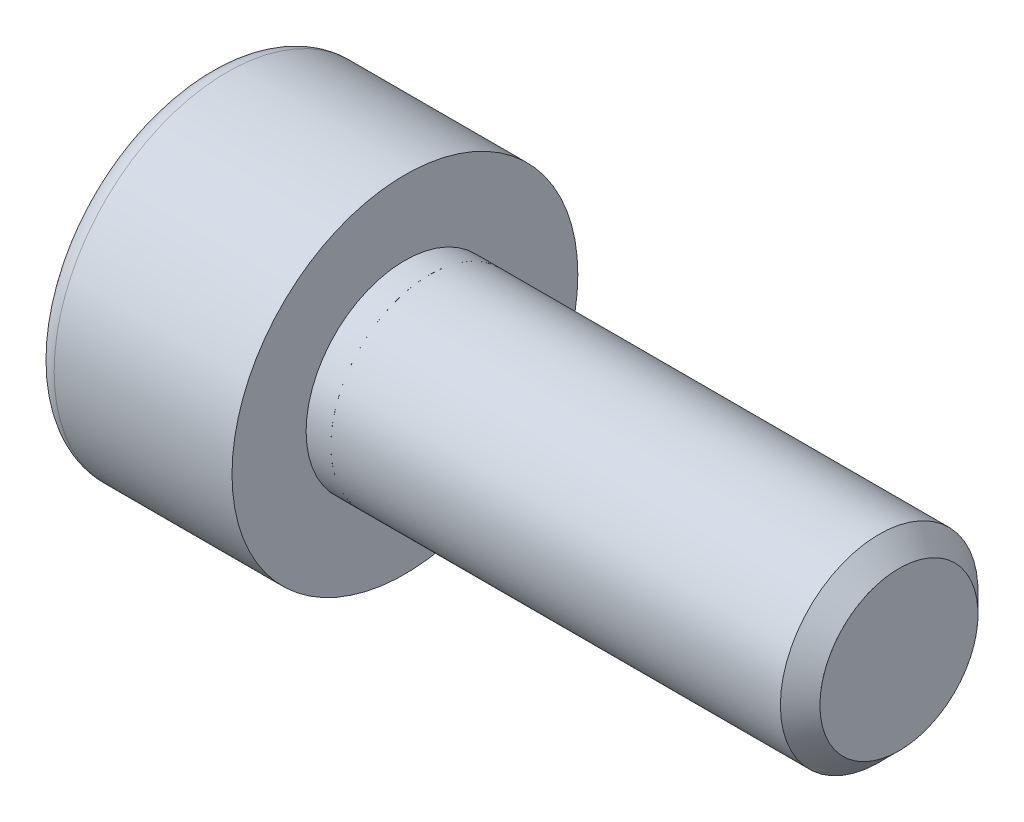
ISO-10303-21;
HEADER;
FILE_DESCRIPTION(('STEP AP214'),'2;1');
FILE_NAME('part.step','',(''),(''),'','','');
FILE_SCHEMA(('AUTOMOTIVE_DESIGN { 1 0 10303 214 1 1 1 1 }'));
ENDSEC;
DATA;
#1=APPLICATION_CONTEXT('core data for automotive mechanical design processes');
#2=APPLICATION_PROTOCOL_DEFINITION('international standard','automotive_design',2000,#1);
#3=PRODUCT_CONTEXT('',#1,'mechanical');
#4=PRODUCT('Part','Part','',(#3));
#5=PRODUCT_RELATED_PRODUCT_CATEGORY('part','',(#4));
#6=PRODUCT_DEFINITION_FORMATION('','',#4);
#7=PRODUCT_DEFINITION_CONTEXT('part definition',#1,'design');
#8=PRODUCT_DEFINITION('design','',#6,#7);
#9=PRODUCT_DEFINITION_SHAPE('','',#8);
#10=(LENGTH_UNIT() NAMED_UNIT(*) SI_UNIT(.MILLI.,.METRE.));
#11=(NAMED_UNIT(*) PLANE_ANGLE_UNIT() SI_UNIT($,.RADIAN.));
#12=(NAMED_UNIT(*) SI_UNIT($,.STERADIAN.) SOLID_ANGLE_UNIT());
#13=UNCERTAINTY_MEASURE_WITH_UNIT(LENGTH_MEASURE(1.E-05),#10,'distance_accuracy_value','');
#14=(GEOMETRIC_REPRESENTATION_CONTEXT(3) GLOBAL_UNCERTAINTY_ASSIGNED_CONTEXT((#13)) GLOBAL_UNIT_ASSIGNED_CONTEXT((#10,
#11,#12)) REPRESENTATION_CONTEXT('',''));
#15=CARTESIAN_POINT('',(0.,0.,0.));
#16=DIRECTION('',(0.,0.,1.));
#17=DIRECTION('',(1.,0.,0.));
#18=AXIS2_PLACEMENT_3D('',#15,#16,#17);
#19=CARTESIAN_POINT('',(2.,-1.5,-0.8660254037844));
#20=DIRECTION('',(0.,-1.,0.));
#21=DIRECTION('',(0.,0.,-1.));
#22=AXIS2_PLACEMENT_3D('',#19,#20,#21);
#23=PLANE('',#22);
#24=DIRECTION('',(1.,0.,0.));
#25=VECTOR('',#24,1.);
#26=CARTESIAN_POINT('',(2.,-1.50000000000005,-0.866025403784492));
#27=LINE('',#26,#25);
#28=CARTESIAN_POINT('',(2.,-1.50000000000002,-0.866025403784446));
#29=VERTEX_POINT('',#28);
#30=CARTESIAN_POINT('',(0.,-1.50000000000001,-0.866025403784442));
#31=VERTEX_POINT('',#30);
#32=EDGE_CURVE('P0_E82',#29,#31,#27,.F.);
#33=ORIENTED_EDGE('',*,*,#32,.T.);
#34=DIRECTION('',(0.,0.,-1.));
#35=VECTOR('',#34,1.);
#36=CARTESIAN_POINT('',(0.,-1.5,-0.8660254037844));
#37=LINE('',#36,#35);
#38=CARTESIAN_POINT('',(0.,-1.5,0.8660254037844));
#39=VERTEX_POINT('',#38);
#40=EDGE_CURVE('P0_E72',#39,#31,#37,.T.);
#41=ORIENTED_EDGE('',*,*,#40,.F.);
#42=DIRECTION('',(1.,0.,0.));
#43=VECTOR('',#42,1.);
#44=CARTESIAN_POINT('',(2.,-1.5,0.8660254037844));
#45=LINE('',#44,#43);
#46=CARTESIAN_POINT('',(2.,-1.50000000000001,0.866025403784396));
#47=VERTEX_POINT('',#46);
#48=EDGE_CURVE('P0_E132',#39,#47,#45,.T.);
#49=ORIENTED_EDGE('',*,*,#48,.T.);
#50=DIRECTION('',(0.,0.,-1.));
#51=VECTOR('',#50,1.);
#52=CARTESIAN_POINT('',(2.,-1.5,-0.8660254037844));
#53=LINE('',#52,#51);
#54=EDGE_CURVE('P0_E68',#29,#47,#53,.F.);
#55=ORIENTED_EDGE('',*,*,#54,.F.);
#56=EDGE_LOOP('',(#33,#41,#49,#55));
#57=FACE_BOUND('',#56,.T.);
#58=ADVANCED_FACE('P0_F17',(#57),#23,.F.);
#59=CARTESIAN_POINT('',(2.,0.,-1.732050807569));
#60=DIRECTION('',(0.,-0.500000000000017,-0.866025403784429));
#61=DIRECTION('',(0.,0.866025403784429,-0.500000000000017));
#62=AXIS2_PLACEMENT_3D('',#59,#60,#61);
#63=PLANE('',#62);
#64=DIRECTION('',(1.,0.,0.));
#65=VECTOR('',#64,1.);
#66=CARTESIAN_POINT('',(2.,0.,-1.73205080756891));
#67=LINE('',#66,#65);
#68=CARTESIAN_POINT('',(2.,0.,-1.73205080756896));
#69=VERTEX_POINT('',#68);
#70=CARTESIAN_POINT('',(0.,0.,-1.73205080756897));
#71=VERTEX_POINT('',#70);
#72=EDGE_CURVE('P0_E87',#69,#71,#67,.F.);
#73=ORIENTED_EDGE('',*,*,#72,.T.);
#74=DIRECTION('',(0.,0.866025403784429,-0.500000000000017));
#75=VECTOR('',#74,1.);
#76=CARTESIAN_POINT('',(0.,0.,-1.732050807569));
#77=LINE('',#76,#75);
#78=EDGE_CURVE('P0_E75',#31,#71,#77,.T.);
#79=ORIENTED_EDGE('',*,*,#78,.F.);
#80=ORIENTED_EDGE('',*,*,#32,.F.);
#81=DIRECTION('',(0.,0.866025403784429,-0.500000000000017));
#82=VECTOR('',#81,1.);
#83=CARTESIAN_POINT('',(2.,0.,-1.732050807569));
#84=LINE('',#83,#82);
#85=EDGE_CURVE('P0_E88',#69,#29,#84,.F.);
#86=ORIENTED_EDGE('',*,*,#85,.F.);
#87=EDGE_LOOP('',(#73,#79,#80,#86));
#88=FACE_BOUND('',#87,.T.);
#89=ADVANCED_FACE('P0_F85',(#88),#63,.F.);
#90=CARTESIAN_POINT('',(2.,-1.5,0.8660254037844));
#91=DIRECTION('',(0.,-0.500000000000017,0.866025403784429));
#92=DIRECTION('',(0.,-0.866025403784429,-0.500000000000017));
#93=AXIS2_PLACEMENT_3D('',#90,#91,#92);
#94=PLANE('',#93);
#95=ORIENTED_EDGE('',*,*,#48,.F.);
#96=DIRECTION('',(0.,-0.866025403784429,-0.500000000000017));
#97=VECTOR('',#96,1.);
#98=CARTESIAN_POINT('',(0.,-1.5,0.8660254037844));
#99=LINE('',#98,#97);
#100=CARTESIAN_POINT('',(0.,0.,1.73205080756896));
#101=VERTEX_POINT('',#100);
#102=EDGE_CURVE('P0_E78',#101,#39,#99,.T.);
#103=ORIENTED_EDGE('',*,*,#102,.F.);
#104=DIRECTION('',(1.,0.,0.));
#105=VECTOR('',#104,1.);
#106=CARTESIAN_POINT('',(2.,0.,1.73205080756899));
#107=LINE('',#106,#105);
#108=CARTESIAN_POINT('',(2.,0.,1.73205080756895));
#109=VERTEX_POINT('',#108);
#110=EDGE_CURVE('P0_E123',#101,#109,#107,.T.);
#111=ORIENTED_EDGE('',*,*,#110,.T.);
#112=DIRECTION('',(0.,-0.866025403784429,-0.500000000000017));
#113=VECTOR('',#112,1.);
#114=CARTESIAN_POINT('',(2.,-1.5,0.8660254037844));
#115=LINE('',#114,#113);
#116=EDGE_CURVE('P0_E130',#47,#109,#115,.F.);
#117=ORIENTED_EDGE('',*,*,#116,.F.);
#118=EDGE_LOOP('',(#95,#103,#111,#117));
#119=FACE_BOUND('',#118,.T.);
#120=ADVANCED_FACE('P0_F135',(#119),#94,.F.);
#121=CARTESIAN_POINT('',(2.,1.5,-0.8660254037844));
#122=DIRECTION('',(0.,0.500000000000017,-0.866025403784429));
#123=DIRECTION('',(0.,0.866025403784429,0.500000000000017));
#124=AXIS2_PLACEMENT_3D('',#121,#122,#123);
#125=PLANE('',#124);
#126=DIRECTION('',(1.,0.,0.));
#127=VECTOR('',#126,1.);
#128=CARTESIAN_POINT('',(2.,1.5,-0.8660254037844));
#129=LINE('',#128,#127);
#130=CARTESIAN_POINT('',(2.,1.5,-0.866025403784398));
#131=VERTEX_POINT('',#130);
#132=CARTESIAN_POINT('',(0.,1.5,-0.8660254037844));
#133=VERTEX_POINT('',#132);
#134=EDGE_CURVE('P0_E115',#131,#133,#129,.F.);
#135=ORIENTED_EDGE('',*,*,#134,.T.);
#136=DIRECTION('',(0.,0.866025403784429,0.500000000000017));
#137=VECTOR('',#136,1.);
#138=CARTESIAN_POINT('',(0.,1.5,-0.8660254037844));
#139=LINE('',#138,#137);
#140=EDGE_CURVE('P0_E36',#71,#133,#139,.T.);
#141=ORIENTED_EDGE('',*,*,#140,.F.);
#142=ORIENTED_EDGE('',*,*,#72,.F.);
#143=DIRECTION('',(0.,-0.866025403784414,-0.500000000000043));
#144=VECTOR('',#143,1.);
#145=CARTESIAN_POINT('',(2.,1.5,-0.8660254037844));
#146=LINE('',#145,#144);
#147=EDGE_CURVE('P0_E117',#131,#69,#146,.T.);
#148=ORIENTED_EDGE('',*,*,#147,.F.);
#149=EDGE_LOOP('',(#135,#141,#142,#148));
#150=FACE_BOUND('',#149,.T.);
#151=ADVANCED_FACE('P0_F142',(#150),#125,.F.);
#152=CARTESIAN_POINT('',(2.,0.,1.732050807569));
#153=DIRECTION('',(0.,0.500000000000017,0.866025403784429));
#154=DIRECTION('',(0.,-0.866025403784429,0.500000000000017));
#155=AXIS2_PLACEMENT_3D('',#152,#153,#154);
#156=PLANE('',#155);
#157=ORIENTED_EDGE('',*,*,#110,.F.);
#158=DIRECTION('',(0.,-0.866025403784429,0.500000000000017));
#159=VECTOR('',#158,1.);
#160=CARTESIAN_POINT('',(0.,0.,1.732050807569));
#161=LINE('',#160,#159);
#162=CARTESIAN_POINT('',(0.,1.50000000000003,0.866025403784459));
#163=VERTEX_POINT('',#162);
#164=EDGE_CURVE('P0_E126',#163,#101,#161,.T.);
#165=ORIENTED_EDGE('',*,*,#164,.F.);
#166=DIRECTION('',(1.,0.,0.));
#167=VECTOR('',#166,1.);
#168=CARTESIAN_POINT('',(2.,1.5,0.866025403784423));
#169=LINE('',#168,#167);
#170=CARTESIAN_POINT('',(2.,1.50000000000003,0.866025403784458));
#171=VERTEX_POINT('',#170);
#172=EDGE_CURVE('P0_E113',#163,#171,#169,.T.);
#173=ORIENTED_EDGE('',*,*,#172,.T.);
#174=DIRECTION('',(0.,0.86602540378441,-0.50000000000005));
#175=VECTOR('',#174,1.);
#176=CARTESIAN_POINT('',(2.,0.,1.73205080756898));
#177=LINE('',#176,#175);
#178=EDGE_CURVE('P0_E120',#109,#171,#177,.T.);
#179=ORIENTED_EDGE('',*,*,#178,.F.);
#180=EDGE_LOOP('',(#157,#165,#173,#179));
#181=FACE_BOUND('',#180,.T.);
#182=ADVANCED_FACE('P0_F149',(#181),#156,.F.);
#183=CARTESIAN_POINT('',(2.,0.,0.));
#184=DIRECTION('',(-1.,0.,0.));
#185=DIRECTION('',(0.,0.,1.));
#186=AXIS2_PLACEMENT_3D('',#183,#184,#185);
#187=PLANE('',#186);
#188=ORIENTED_EDGE('',*,*,#147,.T.);
#189=ORIENTED_EDGE('',*,*,#85,.T.);
#190=ORIENTED_EDGE('',*,*,#54,.T.);
#191=ORIENTED_EDGE('',*,*,#116,.T.);
#192=ORIENTED_EDGE('',*,*,#178,.T.);
#193=DIRECTION('',(0.,0.,1.));
#194=VECTOR('',#193,1.);
#195=CARTESIAN_POINT('',(2.,1.5,0.8660254037844));
#196=LINE('',#195,#194);
#197=EDGE_CURVE('P0_E110',#171,#131,#196,.F.);
#198=ORIENTED_EDGE('',*,*,#197,.T.);
#199=EDGE_LOOP('',(#188,#189,#190,#191,#192,#198));
#200=FACE_BOUND('',#199,.T.);
#201=ADVANCED_FACE('P0_F139',(#200),#187,.T.);
#202=CARTESIAN_POINT('',(2.,1.5,0.8660254037844));
#203=DIRECTION('',(0.,1.,0.));
#204=DIRECTION('',(0.,0.,1.));
#205=AXIS2_PLACEMENT_3D('',#202,#203,#204);
#206=PLANE('',#205);
#207=ORIENTED_EDGE('',*,*,#172,.F.);
#208=DIRECTION('',(0.,0.,1.));
#209=VECTOR('',#208,1.);
#210=CARTESIAN_POINT('',(0.,1.5,0.));
#211=LINE('',#210,#209);
#212=EDGE_CURVE('P0_E106',#133,#163,#211,.T.);
#213=ORIENTED_EDGE('',*,*,#212,.F.);
#214=ORIENTED_EDGE('',*,*,#134,.F.);
#215=ORIENTED_EDGE('',*,*,#197,.F.);
#216=EDGE_LOOP('',(#207,#213,#214,#215));
#217=FACE_BOUND('',#216,.T.);
#218=ADVANCED_FACE('P0_F147',(#217),#206,.F.);
#219=CARTESIAN_POINT('',(0.,0.,0.));
#220=DIRECTION('',(-1.,0.,0.));
#221=DIRECTION('',(0.,0.,1.));
#222=AXIS2_PLACEMENT_3D('',#219,#220,#221);
#223=PLANE('',#222);
#224=CARTESIAN_POINT('',(0.,0.,0.));
#225=DIRECTION('',(-1.,0.,0.));
#226=DIRECTION('',(0.,0.,1.));
#227=AXIS2_PLACEMENT_3D('',#224,#225,#226);
#228=CIRCLE('',#227,3.1);
#229=CARTESIAN_POINT('',(0.,0.,3.1));
#230=VERTEX_POINT('',#229);
#231=EDGE_CURVE('P0_E21',#230,#230,#228,.F.);
#232=ORIENTED_EDGE('',*,*,#231,.F.);
#233=EDGE_LOOP('',(#232));
#234=FACE_BOUND('',#233,.T.);
#235=ORIENTED_EDGE('',*,*,#140,.T.);
#236=ORIENTED_EDGE('',*,*,#212,.T.);
#237=ORIENTED_EDGE('',*,*,#164,.T.);
#238=ORIENTED_EDGE('',*,*,#102,.T.);
#239=ORIENTED_EDGE('',*,*,#40,.T.);
#240=ORIENTED_EDGE('',*,*,#78,.T.);
#241=EDGE_LOOP('',(#235,#236,#237,#238,#239,#240));
#242=FACE_BOUND('',#241,.T.);
#243=ADVANCED_FACE('P0_F73',(#234,#242),#223,.T.);
#244=CARTESIAN_POINT('',(0.4,0.,0.));
#245=DIRECTION('',(-1.,0.,0.));
#246=DIRECTION('',(0.,0.,1.));
#247=AXIS2_PLACEMENT_3D('',#244,#245,#246);
#248=TOROIDAL_SURFACE('',#247,3.1,0.4);
#249=CARTESIAN_POINT('',(0.399999999999999,0.,0.));
#250=DIRECTION('',(-1.,0.,0.));
#251=DIRECTION('',(0.,0.,1.));
#252=AXIS2_PLACEMENT_3D('',#249,#250,#251);
#253=CIRCLE('',#252,3.5);
#254=CARTESIAN_POINT('',(0.399999999999999,0.,3.5));
#255=VERTEX_POINT('',#254);
#256=EDGE_CURVE('P0_E98',#255,#255,#253,.F.);
#257=ORIENTED_EDGE('',*,*,#256,.F.);
#258=EDGE_LOOP('',(#257));
#259=FACE_BOUND('',#258,.T.);
#260=ORIENTED_EDGE('',*,*,#231,.T.);
#261=EDGE_LOOP('',(#260));
#262=FACE_BOUND('',#261,.T.);
#263=ADVANCED_FACE('P0_F19',(#259,#262),#248,.T.);
#264=CARTESIAN_POINT('',(14.,0.,0.));
#265=DIRECTION('',(-1.,0.,0.));
#266=DIRECTION('',(0.,0.,1.));
#267=AXIS2_PLACEMENT_3D('',#264,#265,#266);
#268=PLANE('',#267);
#269=CARTESIAN_POINT('',(14.00000000001,0.,0.));
#270=DIRECTION('',(-1.,0.,0.));
#271=DIRECTION('',(0.,0.,1.));
#272=AXIS2_PLACEMENT_3D('',#269,#270,#271);
#273=CIRCLE('',#272,1.59999999999627);
#274=CARTESIAN_POINT('',(14.00000000001,0.,1.59999999999627));
#275=VERTEX_POINT('',#274);
#276=EDGE_CURVE('P0_E96',#275,#275,#273,.T.);
#277=ORIENTED_EDGE('',*,*,#276,.F.);
#278=EDGE_LOOP('',(#277));
#279=FACE_BOUND('',#278,.T.);
#280=ADVANCED_FACE('P0_F178',(#279),#268,.F.);
#281=CARTESIAN_POINT('',(14.7,0.,0.));
#282=DIRECTION('',(-1.,0.,0.));
#283=DIRECTION('',(0.,0.,1.));
#284=AXIS2_PLACEMENT_3D('',#281,#282,#283);
#285=CYLINDRICAL_SURFACE('',#284,3.5);
#286=ORIENTED_EDGE('',*,*,#256,.T.);
#287=EDGE_LOOP('',(#286));
#288=FACE_BOUND('',#287,.T.);
#289=CARTESIAN_POINT('',(4.,0.,0.));
#290=DIRECTION('',(-1.,0.,0.));
#291=DIRECTION('',(0.,0.,1.));
#292=AXIS2_PLACEMENT_3D('',#289,#290,#291);
#293=CIRCLE('',#292,3.5);
#294=CARTESIAN_POINT('',(4.,0.,3.5));
#295=VERTEX_POINT('',#294);
#296=EDGE_CURVE('P0_E94',#295,#295,#293,.T.);
#297=ORIENTED_EDGE('',*,*,#296,.T.);
#298=EDGE_LOOP('',(#297));
#299=FACE_BOUND('',#298,.T.);
#300=ADVANCED_FACE('P0_F174',(#288,#299),#285,.T.);
#301=CARTESIAN_POINT('',(13.6000000001104,0.,0.));
#302=DIRECTION('',(-1.,0.,0.));
#303=DIRECTION('',(0.,0.,1.));
#304=AXIS2_PLACEMENT_3D('',#301,#302,#303);
#305=CONICAL_SURFACE('',#304,1.99999999989586,0.785398163397448);
#306=CARTESIAN_POINT('',(13.6,0.,0.));
#307=DIRECTION('',(-1.,0.,0.));
#308=DIRECTION('',(0.,0.,1.));
#309=AXIS2_PLACEMENT_3D('',#306,#307,#308);
#310=CIRCLE('',#309,2.);
#311=CARTESIAN_POINT('',(13.6,0.,2.));
#312=VERTEX_POINT('',#311);
#313=EDGE_CURVE('P0_E27',#312,#312,#310,.T.);
#314=ORIENTED_EDGE('',*,*,#313,.F.);
#315=EDGE_LOOP('',(#314));
#316=FACE_BOUND('',#315,.T.);
#317=ORIENTED_EDGE('',*,*,#276,.T.);
#318=EDGE_LOOP('',(#317));
#319=FACE_BOUND('',#318,.T.);
#320=ADVANCED_FACE('P0_F167',(#316,#319),#305,.T.);
#321=CARTESIAN_POINT('',(4.,0.,0.));
#322=DIRECTION('',(-1.,0.,0.));
#323=DIRECTION('',(0.,0.,1.));
#324=AXIS2_PLACEMENT_3D('',#321,#322,#323);
#325=PLANE('',#324);
#326=ORIENTED_EDGE('',*,*,#296,.F.);
#327=EDGE_LOOP('',(#326));
#328=FACE_BOUND('',#327,.T.);
#329=CARTESIAN_POINT('',(4.,0.,0.));
#330=DIRECTION('',(-1.,0.,0.));
#331=DIRECTION('',(0.,0.,1.));
#332=AXIS2_PLACEMENT_3D('',#329,#330,#331);
#333=CIRCLE('',#332,2.);
#334=CARTESIAN_POINT('',(4.,0.,2.));
#335=VERTEX_POINT('',#334);
#336=EDGE_CURVE('P0_E11',#335,#335,#333,.F.);
#337=ORIENTED_EDGE('',*,*,#336,.F.);
#338=EDGE_LOOP('',(#337));
#339=FACE_BOUND('',#338,.T.);
#340=ADVANCED_FACE('P0_F161',(#328,#339),#325,.F.);
#341=CARTESIAN_POINT('',(14.7,0.,0.));
#342=DIRECTION('',(-1.,0.,0.));
#343=DIRECTION('',(0.,0.,1.));
#344=AXIS2_PLACEMENT_3D('',#341,#342,#343);
#345=CYLINDRICAL_SURFACE('',#344,2.);
#346=ORIENTED_EDGE('',*,*,#336,.T.);
#347=EDGE_LOOP('',(#346));
#348=FACE_BOUND('',#347,.T.);
#349=ORIENTED_EDGE('',*,*,#313,.T.);
#350=EDGE_LOOP('',(#349));
#351=FACE_BOUND('',#350,.T.);
#352=ADVANCED_FACE('P0_F159',(#348,#351),#345,.T.);
#353=CLOSED_SHELL('',(#58,#89,#120,#151,#182,#201,#218,#243,#263,#280,#300,#320,#340,#352));
#354=MANIFOLD_SOLID_BREP('P0_B1',#353);
#355=CARTESIAN_POINT('',(14.,0.,0.));
#356=DIRECTION('',(1.,0.,0.));
#357=DIRECTION('',(0.,0.,-1.));
#358=AXIS2_PLACEMENT_3D('',#355,#356,#357);
#359=CYLINDRICAL_SURFACE('',#358,1.6);
#360=CARTESIAN_POINT('',(14.,0.,0.));
#361=DIRECTION('',(1.,0.,0.));
#362=DIRECTION('',(0.,0.,-1.));
#363=AXIS2_PLACEMENT_3D('',#360,#361,#362);
#364=CIRCLE('',#363,1.6);
#365=CARTESIAN_POINT('',(14.,0.,-1.6));
#366=VERTEX_POINT('',#365);
#367=EDGE_CURVE('P1_E11',#366,#366,#364,.F.);
#368=ORIENTED_EDGE('',*,*,#367,.T.);
#369=EDGE_LOOP('',(#368));
#370=FACE_BOUND('',#369,.T.);
#371=CARTESIAN_POINT('',(4.5,0.,0.));
#372=DIRECTION('',(1.,0.,0.));
#373=DIRECTION('',(0.,0.,-1.));
#374=AXIS2_PLACEMENT_3D('',#371,#372,#373);
#375=CIRCLE('',#374,1.6);
#376=CARTESIAN_POINT('',(4.5,0.,-1.6));
#377=VERTEX_POINT('',#376);
#378=EDGE_CURVE('P1_E21',#377,#377,#375,.T.);
#379=ORIENTED_EDGE('',*,*,#378,.T.);
#380=EDGE_LOOP('',(#379));
#381=FACE_BOUND('',#380,.T.);
#382=ADVANCED_FACE('P1_F17',(#370,#381),#359,.T.);
#383=CARTESIAN_POINT('',(4.5,0.,0.));
#384=DIRECTION('',(1.,0.,0.));
#385=DIRECTION('',(0.,0.,-1.));
#386=AXIS2_PLACEMENT_3D('',#383,#384,#385);
#387=PLANE('',#386);
#388=CARTESIAN_POINT('',(4.5,-2.,0.));
#389=CARTESIAN_POINT('',(4.5,-1.99917158919112,-0.399203477579854));
#390=CARTESIAN_POINT('',(4.5,-1.84775394701637,-0.76539585056507));
#391=CARTESIAN_POINT('',(4.5,-1.69618032466144,-1.1319654500841));
#392=CARTESIAN_POINT('',(4.5,-1.4142109186193,-1.41421416288259));
#393=CARTESIAN_POINT('',(4.5,-1.13376052342672,-1.69494236016477));
#394=CARTESIAN_POINT('',(4.5,-0.765364989951929,-1.84775426215911));
#395=CARTESIAN_POINT('',(4.5,-0.39886313910527,-1.9997806572244));
#396=CARTESIAN_POINT('',(4.5,0.,-1.99999390863958));
#397=CARTESIAN_POINT('',(4.5,0.396724231117003,-2.00020601649169));
#398=CARTESIAN_POINT('',(4.5,0.765364989951929,-1.84775426215911));
#399=CARTESIAN_POINT('',(4.5,1.13194664705387,-1.69615405140663));
#400=CARTESIAN_POINT('',(4.5,1.4142109186193,-1.41421416288259));
#401=CARTESIAN_POINT('',(4.5,1.69496615684279,-1.13378157349297));
#402=CARTESIAN_POINT('',(4.5,1.84775394701634,-0.765395850565129));
#403=CARTESIAN_POINT('',(4.5,1.99916927375244,-0.400319265985484));
#404=CARTESIAN_POINT('',(4.5,2.,0.));
#405=B_SPLINE_CURVE_WITH_KNOTS('',2,(#388,#389,#390,#391,#392,#393,#394,#395,#396,#397,#398,
#399,#400,#401,#402,#403,#404),.UNSPECIFIED.,.F.,.F.,(3,2,2,2,2,2,2,2,3),(0.,0.125,0.25,0.375,
0.5,0.625,0.75,0.875,1.),.UNSPECIFIED.);
#406=CARTESIAN_POINT('',(4.5,-2.,0.));
#407=VERTEX_POINT('',#406);
#408=CARTESIAN_POINT('',(4.5,2.,0.));
#409=VERTEX_POINT('',#408);
#410=EDGE_CURVE('P1_E32',#407,#409,#405,.T.);
#411=ORIENTED_EDGE('',*,*,#410,.T.);
#412=CARTESIAN_POINT('',(4.5,2.,0.));
#413=CARTESIAN_POINT('',(4.5,1.99917158919112,0.399203477579854));
#414=CARTESIAN_POINT('',(4.5,1.84775394701637,0.76539585056507));
#415=CARTESIAN_POINT('',(4.5,1.69618032466144,1.1319654500841));
#416=CARTESIAN_POINT('',(4.5,1.4142109186193,1.41421416288259));
#417=CARTESIAN_POINT('',(4.5,1.13376052342672,1.69494236016477));
#418=CARTESIAN_POINT('',(4.5,0.765364989951929,1.84775426215911));
#419=CARTESIAN_POINT('',(4.5,0.39886313910527,1.9997806572244));
#420=CARTESIAN_POINT('',(4.5,0.,1.99999390863958));
#421=CARTESIAN_POINT('',(4.5,-0.396724231117003,2.00020601649169));
#422=CARTESIAN_POINT('',(4.5,-0.765364989951929,1.84775426215911));
#423=CARTESIAN_POINT('',(4.5,-1.13194664705387,1.69615405140663));
#424=CARTESIAN_POINT('',(4.5,-1.4142109186193,1.41421416288259));
#425=CARTESIAN_POINT('',(4.5,-1.69496615684279,1.13378157349297));
#426=CARTESIAN_POINT('',(4.5,-1.84775394701634,0.765395850565129));
#427=CARTESIAN_POINT('',(4.5,-1.99916927375244,0.400319265985484));
#428=CARTESIAN_POINT('',(4.5,-2.,0.));
#429=B_SPLINE_CURVE_WITH_KNOTS('',2,(#412,#413,#414,#415,#416,#417,#418,#419,#420,#421,#422,
#423,#424,#425,#426,#427,#428),.UNSPECIFIED.,.F.,.F.,(3,2,2,2,2,2,2,2,3),(0.,0.125,0.25,0.375,
0.5,0.625,0.75,0.875,1.),.UNSPECIFIED.);
#430=EDGE_CURVE('P1_E35',#409,#407,#429,.T.);
#431=ORIENTED_EDGE('',*,*,#430,.T.);
#432=EDGE_LOOP('',(#411,#431));
#433=FACE_BOUND('',#432,.T.);
#434=ORIENTED_EDGE('',*,*,#378,.F.);
#435=EDGE_LOOP('',(#434));
#436=FACE_BOUND('',#435,.T.);
#437=ADVANCED_FACE('P1_F18',(#433,#436),#387,.T.);
#438=OPEN_SHELL('',(#382,#437));
#439=SHELL_BASED_SURFACE_MODEL('P1_B1',(#438));
#440=ADVANCED_BREP_SHAPE_REPRESENTATION('',(#18,#354),#14);
#441=MANIFOLD_SURFACE_SHAPE_REPRESENTATION('',(#18,#439),#14);
#442=SHAPE_REPRESENTATION('',(#18),#14);
#443=SHAPE_DEFINITION_REPRESENTATION(#9,#442);
#444=SHAPE_REPRESENTATION_RELATIONSHIP('','',#442,#440);
#445=SHAPE_REPRESENTATION_RELATIONSHIP('','',#442,#441);
ENDSEC;
END-ISO-10303-21;
